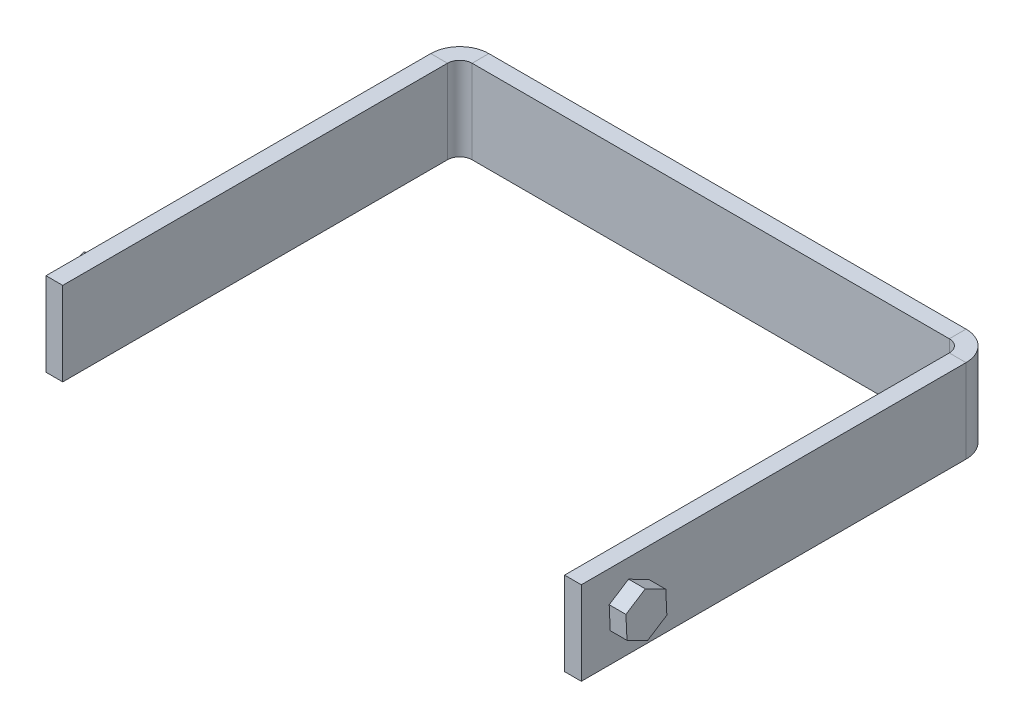
ISO-10303-21;
HEADER;
FILE_DESCRIPTION(('STEP AP214'),'2;1');
FILE_NAME('part.step','',(''),(''),'','','');
FILE_SCHEMA(('AUTOMOTIVE_DESIGN { 1 0 10303 214 1 1 1 1 }'));
ENDSEC;
DATA;
#1=APPLICATION_CONTEXT('core data for automotive mechanical design processes');
#2=APPLICATION_PROTOCOL_DEFINITION('international standard','automotive_design',2000,#1);
#3=PRODUCT_CONTEXT('',#1,'mechanical');
#4=PRODUCT('Part','Part','',(#3));
#5=PRODUCT_RELATED_PRODUCT_CATEGORY('part','',(#4));
#6=PRODUCT_DEFINITION_FORMATION('','',#4);
#7=PRODUCT_DEFINITION_CONTEXT('part definition',#1,'design');
#8=PRODUCT_DEFINITION('design','',#6,#7);
#9=PRODUCT_DEFINITION_SHAPE('','',#8);
#10=(LENGTH_UNIT() NAMED_UNIT(*) SI_UNIT(.MILLI.,.METRE.));
#11=(NAMED_UNIT(*) PLANE_ANGLE_UNIT() SI_UNIT($,.RADIAN.));
#12=(NAMED_UNIT(*) SI_UNIT($,.STERADIAN.) SOLID_ANGLE_UNIT());
#13=UNCERTAINTY_MEASURE_WITH_UNIT(LENGTH_MEASURE(1.E-05),#10,'distance_accuracy_value','');
#14=(GEOMETRIC_REPRESENTATION_CONTEXT(3) GLOBAL_UNCERTAINTY_ASSIGNED_CONTEXT((#13)) GLOBAL_UNIT_ASSIGNED_CONTEXT((#10,
#11,#12)) REPRESENTATION_CONTEXT('',''));
#15=CARTESIAN_POINT('',(0.,0.,0.));
#16=DIRECTION('',(0.,0.,1.));
#17=DIRECTION('',(1.,0.,0.));
#18=AXIS2_PLACEMENT_3D('',#15,#16,#17);
#19=CARTESIAN_POINT('',(-16.,0.,0.));
#20=DIRECTION('',(1.,0.,0.));
#21=DIRECTION('',(0.,0.,-1.));
#22=AXIS2_PLACEMENT_3D('',#19,#20,#21);
#23=PLANE('',#22);
#24=DIRECTION('',(0.,-1.,0.));
#25=VECTOR('',#24,1.);
#26=CARTESIAN_POINT('',(-16.,2.5,0.736599999999993));
#27=LINE('',#26,#25);
#28=CARTESIAN_POINT('',(-16.,-2.5,0.736599999999993));
#29=VERTEX_POINT('',#28);
#30=CARTESIAN_POINT('',(-16.,2.5,0.736599999999993));
#31=VERTEX_POINT('',#30);
#32=EDGE_CURVE('E390',#29,#31,#27,.F.);
#33=ORIENTED_EDGE('',*,*,#32,.F.);
#34=DIRECTION('',(0.,0.,1.));
#35=VECTOR('',#34,1.);
#36=CARTESIAN_POINT('',(-16.,-2.5,0.));
#37=LINE('',#36,#35);
#38=CARTESIAN_POINT('',(-16.0000000000001,-2.5,23.7366));
#39=VERTEX_POINT('',#38);
#40=EDGE_CURVE('E378',#29,#39,#37,.T.);
#41=ORIENTED_EDGE('',*,*,#40,.T.);
#42=DIRECTION('',(0.,1.,0.));
#43=VECTOR('',#42,1.);
#44=CARTESIAN_POINT('',(-16.0000000000001,0.,23.7366));
#45=LINE('',#44,#43);
#46=CARTESIAN_POINT('',(-16.0000000000001,2.5,23.7366));
#47=VERTEX_POINT('',#46);
#48=EDGE_CURVE('E376',#39,#47,#45,.T.);
#49=ORIENTED_EDGE('',*,*,#48,.T.);
#50=DIRECTION('',(0.,0.,-1.));
#51=VECTOR('',#50,1.);
#52=CARTESIAN_POINT('',(-16.,2.5,0.));
#53=LINE('',#52,#51);
#54=EDGE_CURVE('E380',#47,#31,#53,.T.);
#55=ORIENTED_EDGE('',*,*,#54,.T.);
#56=EDGE_LOOP('',(#33,#41,#49,#55));
#57=FACE_BOUND('',#56,.T.);
#58=DIRECTION('',(0.,0.592706894576885,0.80541823739038));
#59=VECTOR('',#58,1.);
#60=CARTESIAN_POINT('',(-16.0000000000001,-1.61001464965031,20.8366627477282));
#61=LINE('',#60,#59);
#62=CARTESIAN_POINT('',(-16.0000000000001,-1.61001464965031,20.8366627477282));
#63=VERTEX_POINT('',#62);
#64=CARTESIAN_POINT('',(-16.0000000000001,-0.649858365278524,22.1414010412317));
#65=VERTEX_POINT('',#64);
#66=EDGE_CURVE('E260',#63,#65,#61,.T.);
#67=ORIENTED_EDGE('',*,*,#66,.F.);
#68=DIRECTION('',(0.,-0.401159206962912,0.916008346396957));
#69=VECTOR('',#68,1.);
#70=CARTESIAN_POINT('',(-16.0000000000001,-0.960156284371791,19.3527738671071));
#71=LINE('',#70,#69);
#72=CARTESIAN_POINT('',(-16.0000000000001,-0.960156284371791,19.3527738671071));
#73=VERTEX_POINT('',#72);
#74=EDGE_CURVE('E257',#73,#63,#71,.T.);
#75=ORIENTED_EDGE('',*,*,#74,.F.);
#76=DIRECTION('',(0.,-0.993866101539797,0.110590109006577));
#77=VECTOR('',#76,1.);
#78=CARTESIAN_POINT('',(-16.0000000000001,0.649858365278522,19.1736232799897));
#79=LINE('',#78,#77);
#80=CARTESIAN_POINT('',(-16.0000000000001,0.649858365278522,19.1736232799897));
#81=VERTEX_POINT('',#80);
#82=EDGE_CURVE('E740',#81,#73,#79,.T.);
#83=ORIENTED_EDGE('',*,*,#82,.F.);
#84=DIRECTION('',(0.,-0.592706894576886,-0.805418237390378));
#85=VECTOR('',#84,1.);
#86=CARTESIAN_POINT('',(-16.0000000000001,1.61001464965032,20.4783615734932));
#87=LINE('',#86,#85);
#88=CARTESIAN_POINT('',(-16.0000000000001,1.61001464965032,20.4783615734932));
#89=VERTEX_POINT('',#88);
#90=EDGE_CURVE('E755',#89,#81,#87,.T.);
#91=ORIENTED_EDGE('',*,*,#90,.F.);
#92=DIRECTION('',(0.,0.401159206962912,-0.916008346396957));
#93=VECTOR('',#92,1.);
#94=CARTESIAN_POINT('',(-16.0000000000001,0.960156284371795,21.9622504541142));
#95=LINE('',#94,#93);
#96=CARTESIAN_POINT('',(-16.0000000000001,0.960156284371794,21.9622504541142));
#97=VERTEX_POINT('',#96);
#98=EDGE_CURVE('E99',#97,#89,#95,.T.);
#99=ORIENTED_EDGE('',*,*,#98,.F.);
#100=DIRECTION('',(0.,0.993866101539797,-0.110590109006577));
#101=VECTOR('',#100,1.);
#102=CARTESIAN_POINT('',(-16.0000000000001,-0.649858365278524,22.1414010412317));
#103=LINE('',#102,#101);
#104=EDGE_CURVE('E94',#65,#97,#103,.T.);
#105=ORIENTED_EDGE('',*,*,#104,.F.);
#106=EDGE_LOOP('',(#67,#75,#83,#91,#99,#105));
#107=FACE_BOUND('',#106,.T.);
#108=ADVANCED_FACE('F77',(#57,#107),#23,.F.);
#109=CARTESIAN_POINT('',(16.,0.,0.));
#110=DIRECTION('',(-1.,0.,0.));
#111=DIRECTION('',(0.,0.,1.));
#112=AXIS2_PLACEMENT_3D('',#109,#110,#111);
#113=PLANE('',#112);
#114=DIRECTION('',(0.,1.,0.));
#115=VECTOR('',#114,1.);
#116=CARTESIAN_POINT('',(16.,-2.5,0.736599999999993));
#117=LINE('',#116,#115);
#118=CARTESIAN_POINT('',(16.,2.5,0.736599999999993));
#119=VERTEX_POINT('',#118);
#120=CARTESIAN_POINT('',(16.,-2.5,0.736599999999993));
#121=VERTEX_POINT('',#120);
#122=EDGE_CURVE('E337',#119,#121,#117,.F.);
#123=ORIENTED_EDGE('',*,*,#122,.F.);
#124=DIRECTION('',(0.,0.,1.));
#125=VECTOR('',#124,1.);
#126=CARTESIAN_POINT('',(16.,2.5,0.));
#127=LINE('',#126,#125);
#128=CARTESIAN_POINT('',(16.0000000000001,2.5,23.7366));
#129=VERTEX_POINT('',#128);
#130=EDGE_CURVE('E325',#119,#129,#127,.T.);
#131=ORIENTED_EDGE('',*,*,#130,.T.);
#132=DIRECTION('',(0.,-1.,0.));
#133=VECTOR('',#132,1.);
#134=CARTESIAN_POINT('',(16.0000000000001,0.,23.7366));
#135=LINE('',#134,#133);
#136=CARTESIAN_POINT('',(16.0000000000001,-2.5,23.7366));
#137=VERTEX_POINT('',#136);
#138=EDGE_CURVE('E323',#129,#137,#135,.T.);
#139=ORIENTED_EDGE('',*,*,#138,.T.);
#140=DIRECTION('',(0.,0.,-1.));
#141=VECTOR('',#140,1.);
#142=CARTESIAN_POINT('',(16.,-2.5,0.));
#143=LINE('',#142,#141);
#144=EDGE_CURVE('E327',#137,#121,#143,.T.);
#145=ORIENTED_EDGE('',*,*,#144,.T.);
#146=EDGE_LOOP('',(#123,#131,#139,#145));
#147=FACE_BOUND('',#146,.T.);
#148=DIRECTION('',(0.,0.53936110364448,-0.842074580946016));
#149=VECTOR('',#148,1.);
#150=CARTESIAN_POINT('',(16.0000000000001,-1.37568604254519,20.7825966217071));
#151=LINE('',#150,#149);
#152=CARTESIAN_POINT('',(16.0000000000001,-1.37568604254519,20.7825966217071));
#153=VERTEX_POINT('',#152);
#154=CARTESIAN_POINT('',(16.0000000000001,-0.632906062300252,19.6229354292825));
#155=VERTEX_POINT('',#154);
#156=EDGE_CURVE('E261',#153,#155,#151,.T.);
#157=ORIENTED_EDGE('',*,*,#156,.F.);
#158=DIRECTION('',(0.,-0.459577427158145,-0.888137708042339));
#159=VECTOR('',#158,1.);
#160=CARTESIAN_POINT('',(16.0000000000001,-0.742779980244938,22.0056935502341));
#161=LINE('',#160,#159);
#162=CARTESIAN_POINT('',(16.0000000000001,-0.742779980244938,22.0056935502341));
#163=VERTEX_POINT('',#162);
#164=EDGE_CURVE('E274',#163,#153,#161,.T.);
#165=ORIENTED_EDGE('',*,*,#164,.F.);
#166=DIRECTION('',(0.,-0.998938530802626,-0.0460631270963242));
#167=VECTOR('',#166,1.);
#168=CARTESIAN_POINT('',(16.0000000000001,0.632906062300256,22.0691292863364));
#169=LINE('',#168,#167);
#170=CARTESIAN_POINT('',(16.0000000000001,0.632906062300256,22.0691292863364));
#171=VERTEX_POINT('',#170);
#172=EDGE_CURVE('E293',#171,#163,#169,.T.);
#173=ORIENTED_EDGE('',*,*,#172,.F.);
#174=DIRECTION('',(0.,-0.53936110364448,0.842074580946016));
#175=VECTOR('',#174,1.);
#176=CARTESIAN_POINT('',(16.0000000000001,1.37568604254519,20.9094680939117));
#177=LINE('',#176,#175);
#178=CARTESIAN_POINT('',(16.0000000000001,1.37568604254519,20.9094680939117));
#179=VERTEX_POINT('',#178);
#180=EDGE_CURVE('E290',#179,#171,#177,.T.);
#181=ORIENTED_EDGE('',*,*,#180,.F.);
#182=DIRECTION('',(0.,0.459577427158145,0.88813770804234));
#183=VECTOR('',#182,1.);
#184=CARTESIAN_POINT('',(16.0000000000001,0.742779980244938,19.6863711653847));
#185=LINE('',#184,#183);
#186=CARTESIAN_POINT('',(16.0000000000001,0.742779980244935,19.6863711653847));
#187=VERTEX_POINT('',#186);
#188=EDGE_CURVE('E287',#187,#179,#185,.T.);
#189=ORIENTED_EDGE('',*,*,#188,.F.);
#190=DIRECTION('',(0.,0.998938530802626,0.0460631270963243));
#191=VECTOR('',#190,1.);
#192=CARTESIAN_POINT('',(16.0000000000001,-0.632906062300252,19.6229354292824));
#193=LINE('',#192,#191);
#194=EDGE_CURVE('E264',#155,#187,#193,.T.);
#195=ORIENTED_EDGE('',*,*,#194,.F.);
#196=EDGE_LOOP('',(#157,#165,#173,#181,#189,#195));
#197=FACE_BOUND('',#196,.T.);
#198=ADVANCED_FACE('F445',(#147,#197),#113,.F.);
#199=CARTESIAN_POINT('',(0.,0.,-1.));
#200=DIRECTION('',(0.,0.,1.));
#201=DIRECTION('',(1.,0.,0.));
#202=AXIS2_PLACEMENT_3D('',#199,#200,#201);
#203=PLANE('',#202);
#204=DIRECTION('',(0.,1.,0.));
#205=VECTOR('',#204,1.);
#206=CARTESIAN_POINT('',(14.2634,2.5,-1.));
#207=LINE('',#206,#205);
#208=CARTESIAN_POINT('',(14.2634,2.5,-1.));
#209=VERTEX_POINT('',#208);
#210=CARTESIAN_POINT('',(14.2634,-2.49999999999999,-1.));
#211=VERTEX_POINT('',#210);
#212=EDGE_CURVE('E346',#209,#211,#207,.F.);
#213=ORIENTED_EDGE('',*,*,#212,.T.);
#214=DIRECTION('',(1.,0.,0.));
#215=VECTOR('',#214,1.);
#216=CARTESIAN_POINT('',(-16.,-2.5,-1.));
#217=LINE('',#216,#215);
#218=CARTESIAN_POINT('',(-14.2634,-2.5,-1.));
#219=VERTEX_POINT('',#218);
#220=EDGE_CURVE('E13',#219,#211,#217,.T.);
#221=ORIENTED_EDGE('',*,*,#220,.F.);
#222=DIRECTION('',(0.,-1.,0.));
#223=VECTOR('',#222,1.);
#224=CARTESIAN_POINT('',(-14.2634,-2.5,-1.));
#225=LINE('',#224,#223);
#226=CARTESIAN_POINT('',(-14.2634,2.50000000000001,-1.));
#227=VERTEX_POINT('',#226);
#228=EDGE_CURVE('E399',#219,#227,#225,.F.);
#229=ORIENTED_EDGE('',*,*,#228,.T.);
#230=DIRECTION('',(-1.,0.,0.));
#231=VECTOR('',#230,1.);
#232=CARTESIAN_POINT('',(-16.,2.5,-1.));
#233=LINE('',#232,#231);
#234=EDGE_CURVE('E86',#209,#227,#233,.T.);
#235=ORIENTED_EDGE('',*,*,#234,.F.);
#236=EDGE_LOOP('',(#213,#221,#229,#235));
#237=FACE_BOUND('',#236,.T.);
#238=ADVANCED_FACE('F478',(#237),#203,.F.);
#239=CARTESIAN_POINT('',(0.,0.,0.));
#240=DIRECTION('',(0.,0.,1.));
#241=DIRECTION('',(1.,0.,0.));
#242=AXIS2_PLACEMENT_3D('',#239,#240,#241);
#243=PLANE('',#242);
#244=DIRECTION('',(1.,0.,0.));
#245=VECTOR('',#244,1.);
#246=CARTESIAN_POINT('',(-16.,-2.5,0.));
#247=LINE('',#246,#245);
#248=CARTESIAN_POINT('',(-14.2634,-2.5,0.));
#249=VERTEX_POINT('',#248);
#250=CARTESIAN_POINT('',(14.2634,-2.5,0.));
#251=VERTEX_POINT('',#250);
#252=EDGE_CURVE('E81',#249,#251,#247,.T.);
#253=ORIENTED_EDGE('',*,*,#252,.T.);
#254=DIRECTION('',(0.,1.,0.));
#255=VECTOR('',#254,1.);
#256=CARTESIAN_POINT('',(14.2634,2.5,0.));
#257=LINE('',#256,#255);
#258=CARTESIAN_POINT('',(14.2634,2.5,0.));
#259=VERTEX_POINT('',#258);
#260=EDGE_CURVE('E358',#259,#251,#257,.F.);
#261=ORIENTED_EDGE('',*,*,#260,.F.);
#262=DIRECTION('',(-1.,0.,0.));
#263=VECTOR('',#262,1.);
#264=CARTESIAN_POINT('',(-16.,2.5,0.));
#265=LINE('',#264,#263);
#266=CARTESIAN_POINT('',(-14.2634,2.5,0.));
#267=VERTEX_POINT('',#266);
#268=EDGE_CURVE('E420',#259,#267,#265,.T.);
#269=ORIENTED_EDGE('',*,*,#268,.T.);
#270=DIRECTION('',(0.,-1.,0.));
#271=VECTOR('',#270,1.);
#272=CARTESIAN_POINT('',(-14.2634,-2.5,0.));
#273=LINE('',#272,#271);
#274=EDGE_CURVE('E412',#249,#267,#273,.F.);
#275=ORIENTED_EDGE('',*,*,#274,.F.);
#276=EDGE_LOOP('',(#253,#261,#269,#275));
#277=FACE_BOUND('',#276,.T.);
#278=ADVANCED_FACE('F428',(#277),#243,.T.);
#279=CARTESIAN_POINT('',(-16.,2.5,-1.));
#280=DIRECTION('',(0.,1.,0.));
#281=DIRECTION('',(0.,0.,1.));
#282=AXIS2_PLACEMENT_3D('',#279,#280,#281);
#283=PLANE('',#282);
#284=ORIENTED_EDGE('',*,*,#268,.F.);
#285=DIRECTION('',(0.,0.,-1.));
#286=VECTOR('',#285,1.);
#287=CARTESIAN_POINT('',(14.2634,2.5,0.));
#288=LINE('',#287,#286);
#289=EDGE_CURVE('E352',#259,#209,#288,.T.);
#290=ORIENTED_EDGE('',*,*,#289,.T.);
#291=ORIENTED_EDGE('',*,*,#234,.T.);
#292=DIRECTION('',(0.,0.,-1.));
#293=VECTOR('',#292,1.);
#294=CARTESIAN_POINT('',(-14.2634,2.5,0.));
#295=LINE('',#294,#293);
#296=EDGE_CURVE('E417',#267,#227,#295,.T.);
#297=ORIENTED_EDGE('',*,*,#296,.F.);
#298=EDGE_LOOP('',(#284,#290,#291,#297));
#299=FACE_BOUND('',#298,.T.);
#300=ADVANCED_FACE('F79',(#299),#283,.T.);
#301=CARTESIAN_POINT('',(-16.,-2.5,-1.));
#302=DIRECTION('',(0.,-1.,0.));
#303=DIRECTION('',(0.,0.,-1.));
#304=AXIS2_PLACEMENT_3D('',#301,#302,#303);
#305=PLANE('',#304);
#306=DIRECTION('',(0.,0.,-1.));
#307=VECTOR('',#306,1.);
#308=CARTESIAN_POINT('',(14.2634,-2.5,0.));
#309=LINE('',#308,#307);
#310=EDGE_CURVE('E363',#251,#211,#309,.T.);
#311=ORIENTED_EDGE('',*,*,#310,.F.);
#312=ORIENTED_EDGE('',*,*,#252,.F.);
#313=DIRECTION('',(0.,0.,-1.));
#314=VECTOR('',#313,1.);
#315=CARTESIAN_POINT('',(-14.2634,-2.5,0.));
#316=LINE('',#315,#314);
#317=EDGE_CURVE('E406',#249,#219,#316,.T.);
#318=ORIENTED_EDGE('',*,*,#317,.T.);
#319=ORIENTED_EDGE('',*,*,#220,.T.);
#320=EDGE_LOOP('',(#311,#312,#318,#319));
#321=FACE_BOUND('',#320,.T.);
#322=ADVANCED_FACE('F512',(#321),#305,.T.);
#323=CARTESIAN_POINT('',(-14.2634,2.5,0.7366));
#324=DIRECTION('',(0.,1.,0.));
#325=DIRECTION('',(0.,0.,1.));
#326=AXIS2_PLACEMENT_3D('',#323,#324,#325);
#327=PLANE('',#326);
#328=DIRECTION('',(1.,0.,0.));
#329=VECTOR('',#328,1.);
#330=CARTESIAN_POINT('',(-16.,2.5,0.736599999999993));
#331=LINE('',#330,#329);
#332=CARTESIAN_POINT('',(-15.,2.5,0.736599999999997));
#333=VERTEX_POINT('',#332);
#334=EDGE_CURVE('E366',#333,#31,#331,.F.);
#335=ORIENTED_EDGE('',*,*,#334,.F.);
#336=CARTESIAN_POINT('',(-14.2634,2.5,0.7366));
#337=DIRECTION('',(0.,-1.,0.));
#338=DIRECTION('',(0.,0.,-1.));
#339=AXIS2_PLACEMENT_3D('',#336,#337,#338);
#340=CIRCLE('',#339,0.7366);
#341=EDGE_CURVE('E409',#267,#333,#340,.F.);
#342=ORIENTED_EDGE('',*,*,#341,.F.);
#343=ORIENTED_EDGE('',*,*,#296,.T.);
#344=CARTESIAN_POINT('',(-14.2634,2.5,0.7366));
#345=DIRECTION('',(0.,-1.,0.));
#346=DIRECTION('',(0.,0.,-1.));
#347=AXIS2_PLACEMENT_3D('',#344,#345,#346);
#348=CIRCLE('',#347,1.7366);
#349=EDGE_CURVE('E402',#227,#31,#348,.F.);
#350=ORIENTED_EDGE('',*,*,#349,.T.);
#351=EDGE_LOOP('',(#335,#342,#343,#350));
#352=FACE_BOUND('',#351,.T.);
#353=ADVANCED_FACE('F509',(#352),#327,.T.);
#354=CARTESIAN_POINT('',(-14.2634,-2.5,0.7366));
#355=DIRECTION('',(0.,1.,0.));
#356=DIRECTION('',(0.,0.,1.));
#357=AXIS2_PLACEMENT_3D('',#354,#355,#356);
#358=PLANE('',#357);
#359=CARTESIAN_POINT('',(-14.2634,-2.5,0.7366));
#360=DIRECTION('',(0.,-1.,0.));
#361=DIRECTION('',(0.,0.,-1.));
#362=AXIS2_PLACEMENT_3D('',#359,#360,#361);
#363=CIRCLE('',#362,0.7366);
#364=CARTESIAN_POINT('',(-15.,-2.5,0.736599999999997));
#365=VERTEX_POINT('',#364);
#366=EDGE_CURVE('E372',#365,#249,#363,.T.);
#367=ORIENTED_EDGE('',*,*,#366,.F.);
#368=DIRECTION('',(1.,0.,0.));
#369=VECTOR('',#368,1.);
#370=CARTESIAN_POINT('',(-15.,-2.5,0.736599999999997));
#371=LINE('',#370,#369);
#372=EDGE_CURVE('E392',#365,#29,#371,.F.);
#373=ORIENTED_EDGE('',*,*,#372,.T.);
#374=CARTESIAN_POINT('',(-14.2634,-2.5,0.7366));
#375=DIRECTION('',(0.,-1.,0.));
#376=DIRECTION('',(0.,0.,-1.));
#377=AXIS2_PLACEMENT_3D('',#374,#375,#376);
#378=CIRCLE('',#377,1.7366);
#379=EDGE_CURVE('E403',#29,#219,#378,.T.);
#380=ORIENTED_EDGE('',*,*,#379,.T.);
#381=ORIENTED_EDGE('',*,*,#317,.F.);
#382=EDGE_LOOP('',(#367,#373,#380,#381));
#383=FACE_BOUND('',#382,.T.);
#384=ADVANCED_FACE('F504',(#383),#358,.F.);
#385=CARTESIAN_POINT('',(-14.2634,-2.5,0.7366));
#386=DIRECTION('',(0.,-1.,0.));
#387=DIRECTION('',(-1.,0.,0.));
#388=AXIS2_PLACEMENT_3D('',#385,#386,#387);
#389=CYLINDRICAL_SURFACE('',#388,1.7366);
#390=ORIENTED_EDGE('',*,*,#228,.F.);
#391=ORIENTED_EDGE('',*,*,#379,.F.);
#392=ORIENTED_EDGE('',*,*,#32,.T.);
#393=ORIENTED_EDGE('',*,*,#349,.F.);
#394=EDGE_LOOP('',(#390,#391,#392,#393));
#395=FACE_BOUND('',#394,.T.);
#396=ADVANCED_FACE('F501',(#395),#389,.T.);
#397=CARTESIAN_POINT('',(-14.2634,-2.5,0.7366));
#398=DIRECTION('',(0.,-1.,0.));
#399=DIRECTION('',(-1.,0.,0.));
#400=AXIS2_PLACEMENT_3D('',#397,#398,#399);
#401=CYLINDRICAL_SURFACE('',#400,0.7366);
#402=ORIENTED_EDGE('',*,*,#274,.T.);
#403=ORIENTED_EDGE('',*,*,#341,.T.);
#404=DIRECTION('',(0.,-1.,0.));
#405=VECTOR('',#404,1.);
#406=CARTESIAN_POINT('',(-15.,2.5,0.736599999999997));
#407=LINE('',#406,#405);
#408=EDGE_CURVE('E395',#333,#365,#407,.T.);
#409=ORIENTED_EDGE('',*,*,#408,.T.);
#410=ORIENTED_EDGE('',*,*,#366,.T.);
#411=EDGE_LOOP('',(#402,#403,#409,#410));
#412=FACE_BOUND('',#411,.T.);
#413=ADVANCED_FACE('F499',(#412),#401,.F.);
#414=CARTESIAN_POINT('',(-16.,2.5,0.));
#415=DIRECTION('',(0.,-1.,0.));
#416=DIRECTION('',(0.,0.,-1.));
#417=AXIS2_PLACEMENT_3D('',#414,#415,#416);
#418=PLANE('',#417);
#419=ORIENTED_EDGE('',*,*,#334,.T.);
#420=ORIENTED_EDGE('',*,*,#54,.F.);
#421=DIRECTION('',(1.,0.,0.));
#422=VECTOR('',#421,1.);
#423=CARTESIAN_POINT('',(-16.0000000000001,2.5,23.7366));
#424=LINE('',#423,#422);
#425=CARTESIAN_POINT('',(-15.0000000000001,2.5,23.7366));
#426=VERTEX_POINT('',#425);
#427=EDGE_CURVE('E373',#47,#426,#424,.T.);
#428=ORIENTED_EDGE('',*,*,#427,.T.);
#429=DIRECTION('',(0.,0.,1.));
#430=VECTOR('',#429,1.);
#431=CARTESIAN_POINT('',(-15.,2.5,0.));
#432=LINE('',#431,#430);
#433=EDGE_CURVE('E387',#426,#333,#432,.F.);
#434=ORIENTED_EDGE('',*,*,#433,.T.);
#435=EDGE_LOOP('',(#419,#420,#428,#434));
#436=FACE_BOUND('',#435,.T.);
#437=ADVANCED_FACE('F495',(#436),#418,.F.);
#438=CARTESIAN_POINT('',(-16.0000000000001,-2.5,23.7366));
#439=DIRECTION('',(0.,1.,0.));
#440=DIRECTION('',(0.,0.,1.));
#441=AXIS2_PLACEMENT_3D('',#438,#439,#440);
#442=PLANE('',#441);
#443=ORIENTED_EDGE('',*,*,#372,.F.);
#444=DIRECTION('',(0.,0.,-1.));
#445=VECTOR('',#444,1.);
#446=CARTESIAN_POINT('',(-15.0000000000001,-2.5,23.7366));
#447=LINE('',#446,#445);
#448=CARTESIAN_POINT('',(-15.0000000000001,-2.5,23.7366));
#449=VERTEX_POINT('',#448);
#450=EDGE_CURVE('E385',#365,#449,#447,.F.);
#451=ORIENTED_EDGE('',*,*,#450,.T.);
#452=DIRECTION('',(1.,0.,0.));
#453=VECTOR('',#452,1.);
#454=CARTESIAN_POINT('',(-16.0000000000001,-2.5,23.7366));
#455=LINE('',#454,#453);
#456=EDGE_CURVE('E369',#39,#449,#455,.T.);
#457=ORIENTED_EDGE('',*,*,#456,.F.);
#458=ORIENTED_EDGE('',*,*,#40,.F.);
#459=EDGE_LOOP('',(#443,#451,#457,#458));
#460=FACE_BOUND('',#459,.T.);
#461=ADVANCED_FACE('F488',(#460),#442,.F.);
#462=CARTESIAN_POINT('',(-15.,0.,0.));
#463=DIRECTION('',(1.,0.,0.));
#464=DIRECTION('',(0.,0.,-1.));
#465=AXIS2_PLACEMENT_3D('',#462,#463,#464);
#466=PLANE('',#465);
#467=ORIENTED_EDGE('',*,*,#450,.F.);
#468=ORIENTED_EDGE('',*,*,#408,.F.);
#469=ORIENTED_EDGE('',*,*,#433,.F.);
#470=DIRECTION('',(0.,-1.,0.));
#471=VECTOR('',#470,1.);
#472=CARTESIAN_POINT('',(-15.0000000000001,2.5,23.7366));
#473=LINE('',#472,#471);
#474=EDGE_CURVE('E383',#449,#426,#473,.F.);
#475=ORIENTED_EDGE('',*,*,#474,.F.);
#476=EDGE_LOOP('',(#467,#468,#469,#475));
#477=FACE_BOUND('',#476,.T.);
#478=ADVANCED_FACE('F484',(#477),#466,.T.);
#479=CARTESIAN_POINT('',(-16.0000000000001,2.5,23.7366));
#480=DIRECTION('',(0.,0.,-1.));
#481=DIRECTION('',(-1.,0.,0.));
#482=AXIS2_PLACEMENT_3D('',#479,#480,#481);
#483=PLANE('',#482);
#484=ORIENTED_EDGE('',*,*,#474,.T.);
#485=ORIENTED_EDGE('',*,*,#427,.F.);
#486=ORIENTED_EDGE('',*,*,#48,.F.);
#487=ORIENTED_EDGE('',*,*,#456,.T.);
#488=EDGE_LOOP('',(#484,#485,#486,#487));
#489=FACE_BOUND('',#488,.T.);
#490=ADVANCED_FACE('F487',(#489),#483,.F.);
#491=CARTESIAN_POINT('',(14.2634,-2.5,0.7366));
#492=DIRECTION('',(0.,-1.,0.));
#493=DIRECTION('',(0.,0.,-1.));
#494=AXIS2_PLACEMENT_3D('',#491,#492,#493);
#495=PLANE('',#494);
#496=DIRECTION('',(-1.,0.,0.));
#497=VECTOR('',#496,1.);
#498=CARTESIAN_POINT('',(16.,-2.5,0.736599999999993));
#499=LINE('',#498,#497);
#500=CARTESIAN_POINT('',(15.,-2.5,0.736599999999997));
#501=VERTEX_POINT('',#500);
#502=EDGE_CURVE('E315',#501,#121,#499,.F.);
#503=ORIENTED_EDGE('',*,*,#502,.F.);
#504=CARTESIAN_POINT('',(14.2634,-2.5,0.7366));
#505=DIRECTION('',(0.,1.,0.));
#506=DIRECTION('',(0.,0.,1.));
#507=AXIS2_PLACEMENT_3D('',#504,#505,#506);
#508=CIRCLE('',#507,0.7366);
#509=EDGE_CURVE('E355',#251,#501,#508,.F.);
#510=ORIENTED_EDGE('',*,*,#509,.F.);
#511=ORIENTED_EDGE('',*,*,#310,.T.);
#512=CARTESIAN_POINT('',(14.2634,-2.5,0.7366));
#513=DIRECTION('',(0.,1.,0.));
#514=DIRECTION('',(0.,0.,1.));
#515=AXIS2_PLACEMENT_3D('',#512,#513,#514);
#516=CIRCLE('',#515,1.7366);
#517=EDGE_CURVE('E348',#211,#121,#516,.F.);
#518=ORIENTED_EDGE('',*,*,#517,.T.);
#519=EDGE_LOOP('',(#503,#510,#511,#518));
#520=FACE_BOUND('',#519,.T.);
#521=ADVANCED_FACE('F437',(#520),#495,.T.);
#522=CARTESIAN_POINT('',(14.2634,2.5,0.7366));
#523=DIRECTION('',(0.,-1.,0.));
#524=DIRECTION('',(0.,0.,-1.));
#525=AXIS2_PLACEMENT_3D('',#522,#523,#524);
#526=PLANE('',#525);
#527=CARTESIAN_POINT('',(14.2634,2.5,0.7366));
#528=DIRECTION('',(0.,1.,0.));
#529=DIRECTION('',(0.,0.,1.));
#530=AXIS2_PLACEMENT_3D('',#527,#528,#529);
#531=CIRCLE('',#530,0.7366);
#532=CARTESIAN_POINT('',(15.,2.5,0.736599999999997));
#533=VERTEX_POINT('',#532);
#534=EDGE_CURVE('E319',#533,#259,#531,.T.);
#535=ORIENTED_EDGE('',*,*,#534,.F.);
#536=DIRECTION('',(-1.,0.,0.));
#537=VECTOR('',#536,1.);
#538=CARTESIAN_POINT('',(15.,2.5,0.736599999999997));
#539=LINE('',#538,#537);
#540=EDGE_CURVE('E339',#533,#119,#539,.F.);
#541=ORIENTED_EDGE('',*,*,#540,.T.);
#542=CARTESIAN_POINT('',(14.2634,2.5,0.7366));
#543=DIRECTION('',(0.,1.,0.));
#544=DIRECTION('',(0.,0.,1.));
#545=AXIS2_PLACEMENT_3D('',#542,#543,#544);
#546=CIRCLE('',#545,1.7366);
#547=EDGE_CURVE('E349',#119,#209,#546,.T.);
#548=ORIENTED_EDGE('',*,*,#547,.T.);
#549=ORIENTED_EDGE('',*,*,#289,.F.);
#550=EDGE_LOOP('',(#535,#541,#548,#549));
#551=FACE_BOUND('',#550,.T.);
#552=ADVANCED_FACE('F460',(#551),#526,.F.);
#553=CARTESIAN_POINT('',(14.2634,2.5,0.7366));
#554=DIRECTION('',(0.,1.,0.));
#555=DIRECTION('',(1.,0.,0.));
#556=AXIS2_PLACEMENT_3D('',#553,#554,#555);
#557=CYLINDRICAL_SURFACE('',#556,1.7366);
#558=ORIENTED_EDGE('',*,*,#212,.F.);
#559=ORIENTED_EDGE('',*,*,#547,.F.);
#560=ORIENTED_EDGE('',*,*,#122,.T.);
#561=ORIENTED_EDGE('',*,*,#517,.F.);
#562=EDGE_LOOP('',(#558,#559,#560,#561));
#563=FACE_BOUND('',#562,.T.);
#564=ADVANCED_FACE('F529',(#563),#557,.T.);
#565=CARTESIAN_POINT('',(14.2634,2.5,0.7366));
#566=DIRECTION('',(0.,1.,0.));
#567=DIRECTION('',(1.,0.,0.));
#568=AXIS2_PLACEMENT_3D('',#565,#566,#567);
#569=CYLINDRICAL_SURFACE('',#568,0.7366);
#570=ORIENTED_EDGE('',*,*,#260,.T.);
#571=ORIENTED_EDGE('',*,*,#509,.T.);
#572=DIRECTION('',(0.,1.,0.));
#573=VECTOR('',#572,1.);
#574=CARTESIAN_POINT('',(15.,-2.5,0.736599999999997));
#575=LINE('',#574,#573);
#576=EDGE_CURVE('E342',#501,#533,#575,.T.);
#577=ORIENTED_EDGE('',*,*,#576,.T.);
#578=ORIENTED_EDGE('',*,*,#534,.T.);
#579=EDGE_LOOP('',(#570,#571,#577,#578));
#580=FACE_BOUND('',#579,.T.);
#581=ADVANCED_FACE('F433',(#580),#569,.F.);
#582=CARTESIAN_POINT('',(16.,-2.5,0.));
#583=DIRECTION('',(0.,1.,0.));
#584=DIRECTION('',(0.,0.,1.));
#585=AXIS2_PLACEMENT_3D('',#582,#583,#584);
#586=PLANE('',#585);
#587=ORIENTED_EDGE('',*,*,#502,.T.);
#588=ORIENTED_EDGE('',*,*,#144,.F.);
#589=DIRECTION('',(-1.,0.,0.));
#590=VECTOR('',#589,1.);
#591=CARTESIAN_POINT('',(16.0000000000001,-2.5,23.7366));
#592=LINE('',#591,#590);
#593=CARTESIAN_POINT('',(15.0000000000001,-2.5,23.7366));
#594=VERTEX_POINT('',#593);
#595=EDGE_CURVE('E320',#137,#594,#592,.T.);
#596=ORIENTED_EDGE('',*,*,#595,.T.);
#597=DIRECTION('',(0.,0.,1.));
#598=VECTOR('',#597,1.);
#599=CARTESIAN_POINT('',(15.,-2.5,0.));
#600=LINE('',#599,#598);
#601=EDGE_CURVE('E334',#594,#501,#600,.F.);
#602=ORIENTED_EDGE('',*,*,#601,.T.);
#603=EDGE_LOOP('',(#587,#588,#596,#602));
#604=FACE_BOUND('',#603,.T.);
#605=ADVANCED_FACE('F441',(#604),#586,.F.);
#606=CARTESIAN_POINT('',(16.0000000000001,2.5,23.7366));
#607=DIRECTION('',(0.,-1.,0.));
#608=DIRECTION('',(0.,0.,-1.));
#609=AXIS2_PLACEMENT_3D('',#606,#607,#608);
#610=PLANE('',#609);
#611=ORIENTED_EDGE('',*,*,#540,.F.);
#612=DIRECTION('',(0.,0.,-1.));
#613=VECTOR('',#612,1.);
#614=CARTESIAN_POINT('',(15.0000000000001,2.5,23.7366));
#615=LINE('',#614,#613);
#616=CARTESIAN_POINT('',(15.0000000000001,2.5,23.7366));
#617=VERTEX_POINT('',#616);
#618=EDGE_CURVE('E332',#533,#617,#615,.F.);
#619=ORIENTED_EDGE('',*,*,#618,.T.);
#620=DIRECTION('',(-1.,0.,0.));
#621=VECTOR('',#620,1.);
#622=CARTESIAN_POINT('',(16.0000000000001,2.5,23.7366));
#623=LINE('',#622,#621);
#624=EDGE_CURVE('E316',#129,#617,#623,.T.);
#625=ORIENTED_EDGE('',*,*,#624,.F.);
#626=ORIENTED_EDGE('',*,*,#130,.F.);
#627=EDGE_LOOP('',(#611,#619,#625,#626));
#628=FACE_BOUND('',#627,.T.);
#629=ADVANCED_FACE('F462',(#628),#610,.F.);
#630=CARTESIAN_POINT('',(15.,0.,0.));
#631=DIRECTION('',(-1.,0.,0.));
#632=DIRECTION('',(0.,0.,1.));
#633=AXIS2_PLACEMENT_3D('',#630,#631,#632);
#634=PLANE('',#633);
#635=ORIENTED_EDGE('',*,*,#618,.F.);
#636=ORIENTED_EDGE('',*,*,#576,.F.);
#637=ORIENTED_EDGE('',*,*,#601,.F.);
#638=DIRECTION('',(0.,1.,0.));
#639=VECTOR('',#638,1.);
#640=CARTESIAN_POINT('',(15.0000000000001,-2.5,23.7366));
#641=LINE('',#640,#639);
#642=EDGE_CURVE('E330',#617,#594,#641,.F.);
#643=ORIENTED_EDGE('',*,*,#642,.F.);
#644=EDGE_LOOP('',(#635,#636,#637,#643));
#645=FACE_BOUND('',#644,.T.);
#646=ADVANCED_FACE('F456',(#645),#634,.T.);
#647=CARTESIAN_POINT('',(16.0000000000001,-2.5,23.7366));
#648=DIRECTION('',(0.,0.,-1.));
#649=DIRECTION('',(-1.,0.,0.));
#650=AXIS2_PLACEMENT_3D('',#647,#648,#649);
#651=PLANE('',#650);
#652=ORIENTED_EDGE('',*,*,#642,.T.);
#653=ORIENTED_EDGE('',*,*,#595,.F.);
#654=ORIENTED_EDGE('',*,*,#138,.F.);
#655=ORIENTED_EDGE('',*,*,#624,.T.);
#656=EDGE_LOOP('',(#652,#653,#654,#655));
#657=FACE_BOUND('',#656,.T.);
#658=ADVANCED_FACE('F452',(#657),#651,.F.);
#659=CARTESIAN_POINT('',(17.0000000000001,-1.37568604254519,20.7825966217071));
#660=DIRECTION('',(0.,0.842074580946016,0.53936110364448));
#661=DIRECTION('',(0.,-0.53936110364448,0.842074580946016));
#662=AXIS2_PLACEMENT_3D('',#659,#660,#661);
#663=PLANE('',#662);
#664=ORIENTED_EDGE('',*,*,#156,.T.);
#665=DIRECTION('',(-1.,0.,0.));
#666=VECTOR('',#665,1.);
#667=CARTESIAN_POINT('',(17.0000000000001,-0.632906062300252,19.6229354292824));
#668=LINE('',#667,#666);
#669=CARTESIAN_POINT('',(17.0000000000001,-0.632906062300252,19.6229354292824));
#670=VERTEX_POINT('',#669);
#671=EDGE_CURVE('E312',#670,#155,#668,.T.);
#672=ORIENTED_EDGE('',*,*,#671,.F.);
#673=DIRECTION('',(0.,0.53936110364448,-0.842074580946016));
#674=VECTOR('',#673,1.);
#675=CARTESIAN_POINT('',(17.0000000000001,-1.37568604254519,20.7825966217071));
#676=LINE('',#675,#674);
#677=CARTESIAN_POINT('',(17.0000000000001,-1.37568604254519,20.7825966217071));
#678=VERTEX_POINT('',#677);
#679=EDGE_CURVE('E270',#678,#670,#676,.T.);
#680=ORIENTED_EDGE('',*,*,#679,.F.);
#681=DIRECTION('',(-1.,0.,0.));
#682=VECTOR('',#681,1.);
#683=CARTESIAN_POINT('',(17.0000000000001,-1.37568604254519,20.7825966217071));
#684=LINE('',#683,#682);
#685=EDGE_CURVE('E283',#678,#153,#684,.T.);
#686=ORIENTED_EDGE('',*,*,#685,.T.);
#687=EDGE_LOOP('',(#664,#672,#680,#686));
#688=FACE_BOUND('',#687,.T.);
#689=ADVANCED_FACE('F587',(#688),#663,.F.);
#690=CARTESIAN_POINT('',(17.0000000000001,-0.632906062300252,19.6229354292824));
#691=DIRECTION('',(0.,-0.0460631270963243,0.998938530802626));
#692=DIRECTION('',(0.,-0.998938530802626,-0.0460631270963243));
#693=AXIS2_PLACEMENT_3D('',#690,#691,#692);
#694=PLANE('',#693);
#695=ORIENTED_EDGE('',*,*,#194,.T.);
#696=DIRECTION('',(-1.,0.,0.));
#697=VECTOR('',#696,1.);
#698=CARTESIAN_POINT('',(17.0000000000001,0.742779980244938,19.6863711653847));
#699=LINE('',#698,#697);
#700=CARTESIAN_POINT('',(17.0000000000001,0.742779980244938,19.6863711653847));
#701=VERTEX_POINT('',#700);
#702=EDGE_CURVE('E309',#701,#187,#699,.T.);
#703=ORIENTED_EDGE('',*,*,#702,.F.);
#704=DIRECTION('',(0.,0.998938530802626,0.0460631270963243));
#705=VECTOR('',#704,1.);
#706=CARTESIAN_POINT('',(17.0000000000001,-0.632906062300252,19.6229354292824));
#707=LINE('',#706,#705);
#708=EDGE_CURVE('E273',#670,#701,#707,.T.);
#709=ORIENTED_EDGE('',*,*,#708,.F.);
#710=ORIENTED_EDGE('',*,*,#671,.T.);
#711=EDGE_LOOP('',(#695,#703,#709,#710));
#712=FACE_BOUND('',#711,.T.);
#713=ADVANCED_FACE('F603',(#712),#694,.F.);
#714=CARTESIAN_POINT('',(17.0000000000001,0.742779980244938,19.6863711653847));
#715=DIRECTION('',(0.,-0.88813770804234,0.459577427158145));
#716=DIRECTION('',(0.,-0.459577427158145,-0.88813770804234));
#717=AXIS2_PLACEMENT_3D('',#714,#715,#716);
#718=PLANE('',#717);
#719=ORIENTED_EDGE('',*,*,#188,.T.);
#720=DIRECTION('',(-1.,0.,0.));
#721=VECTOR('',#720,1.);
#722=CARTESIAN_POINT('',(17.0000000000001,1.37568604254519,20.9094680939117));
#723=LINE('',#722,#721);
#724=CARTESIAN_POINT('',(17.0000000000001,1.37568604254519,20.9094680939117));
#725=VERTEX_POINT('',#724);
#726=EDGE_CURVE('E306',#725,#179,#723,.T.);
#727=ORIENTED_EDGE('',*,*,#726,.F.);
#728=DIRECTION('',(0.,0.459577427158145,0.88813770804234));
#729=VECTOR('',#728,1.);
#730=CARTESIAN_POINT('',(17.0000000000001,0.742779980244938,19.6863711653847));
#731=LINE('',#730,#729);
#732=EDGE_CURVE('E276',#701,#725,#731,.T.);
#733=ORIENTED_EDGE('',*,*,#732,.F.);
#734=ORIENTED_EDGE('',*,*,#702,.T.);
#735=EDGE_LOOP('',(#719,#727,#733,#734));
#736=FACE_BOUND('',#735,.T.);
#737=ADVANCED_FACE('F613',(#736),#718,.F.);
#738=CARTESIAN_POINT('',(17.0000000000001,1.37568604254519,20.9094680939117));
#739=DIRECTION('',(0.,-0.842074580946016,-0.53936110364448));
#740=DIRECTION('',(0.,0.53936110364448,-0.842074580946016));
#741=AXIS2_PLACEMENT_3D('',#738,#739,#740);
#742=PLANE('',#741);
#743=ORIENTED_EDGE('',*,*,#180,.T.);
#744=DIRECTION('',(-1.,0.,0.));
#745=VECTOR('',#744,1.);
#746=CARTESIAN_POINT('',(17.0000000000001,0.632906062300256,22.0691292863364));
#747=LINE('',#746,#745);
#748=CARTESIAN_POINT('',(17.0000000000001,0.632906062300256,22.0691292863364));
#749=VERTEX_POINT('',#748);
#750=EDGE_CURVE('E303',#749,#171,#747,.T.);
#751=ORIENTED_EDGE('',*,*,#750,.F.);
#752=DIRECTION('',(0.,-0.53936110364448,0.842074580946016));
#753=VECTOR('',#752,1.);
#754=CARTESIAN_POINT('',(17.0000000000001,1.37568604254519,20.9094680939117));
#755=LINE('',#754,#753);
#756=EDGE_CURVE('E278',#725,#749,#755,.T.);
#757=ORIENTED_EDGE('',*,*,#756,.F.);
#758=ORIENTED_EDGE('',*,*,#726,.T.);
#759=EDGE_LOOP('',(#743,#751,#757,#758));
#760=FACE_BOUND('',#759,.T.);
#761=ADVANCED_FACE('F623',(#760),#742,.F.);
#762=CARTESIAN_POINT('',(17.0000000000001,0.632906062300256,22.0691292863364));
#763=DIRECTION('',(0.,0.0460631270963242,-0.998938530802626));
#764=DIRECTION('',(0.,0.998938530802626,0.0460631270963242));
#765=AXIS2_PLACEMENT_3D('',#762,#763,#764);
#766=PLANE('',#765);
#767=ORIENTED_EDGE('',*,*,#172,.T.);
#768=DIRECTION('',(-1.,0.,0.));
#769=VECTOR('',#768,1.);
#770=CARTESIAN_POINT('',(17.0000000000001,-0.742779980244938,22.0056935502341));
#771=LINE('',#770,#769);
#772=CARTESIAN_POINT('',(17.0000000000001,-0.742779980244938,22.0056935502341));
#773=VERTEX_POINT('',#772);
#774=EDGE_CURVE('E300',#773,#163,#771,.T.);
#775=ORIENTED_EDGE('',*,*,#774,.F.);
#776=DIRECTION('',(0.,-0.998938530802626,-0.0460631270963242));
#777=VECTOR('',#776,1.);
#778=CARTESIAN_POINT('',(17.0000000000001,0.632906062300256,22.0691292863364));
#779=LINE('',#778,#777);
#780=EDGE_CURVE('E280',#749,#773,#779,.T.);
#781=ORIENTED_EDGE('',*,*,#780,.F.);
#782=ORIENTED_EDGE('',*,*,#750,.T.);
#783=EDGE_LOOP('',(#767,#775,#781,#782));
#784=FACE_BOUND('',#783,.T.);
#785=ADVANCED_FACE('F633',(#784),#766,.F.);
#786=CARTESIAN_POINT('',(17.0000000000001,-0.742779980244938,22.0056935502341));
#787=DIRECTION('',(0.,0.888137708042339,-0.459577427158145));
#788=DIRECTION('',(0.,0.459577427158145,0.888137708042339));
#789=AXIS2_PLACEMENT_3D('',#786,#787,#788);
#790=PLANE('',#789);
#791=ORIENTED_EDGE('',*,*,#164,.T.);
#792=ORIENTED_EDGE('',*,*,#685,.F.);
#793=DIRECTION('',(0.,-0.459577427158145,-0.888137708042339));
#794=VECTOR('',#793,1.);
#795=CARTESIAN_POINT('',(17.0000000000001,-0.742779980244938,22.0056935502341));
#796=LINE('',#795,#794);
#797=EDGE_CURVE('E282',#773,#678,#796,.T.);
#798=ORIENTED_EDGE('',*,*,#797,.F.);
#799=ORIENTED_EDGE('',*,*,#774,.T.);
#800=EDGE_LOOP('',(#791,#792,#798,#799));
#801=FACE_BOUND('',#800,.T.);
#802=ADVANCED_FACE('F643',(#801),#790,.F.);
#803=CARTESIAN_POINT('',(17.,0.,0.));
#804=DIRECTION('',(1.,0.,0.));
#805=DIRECTION('',(0.,0.,-1.));
#806=AXIS2_PLACEMENT_3D('',#803,#804,#805);
#807=PLANE('',#806);
#808=ORIENTED_EDGE('',*,*,#679,.T.);
#809=ORIENTED_EDGE('',*,*,#708,.T.);
#810=ORIENTED_EDGE('',*,*,#732,.T.);
#811=ORIENTED_EDGE('',*,*,#756,.T.);
#812=ORIENTED_EDGE('',*,*,#780,.T.);
#813=ORIENTED_EDGE('',*,*,#797,.T.);
#814=EDGE_LOOP('',(#808,#809,#810,#811,#812,#813));
#815=FACE_BOUND('',#814,.T.);
#816=ADVANCED_FACE('F653',(#815),#807,.T.);
#817=CARTESIAN_POINT('',(-17.0000000000001,-1.61001464965031,20.8366627477282));
#818=DIRECTION('',(0.,0.80541823739038,-0.592706894576885));
#819=DIRECTION('',(0.,0.592706894576885,0.80541823739038));
#820=AXIS2_PLACEMENT_3D('',#817,#818,#819);
#821=PLANE('',#820);
#822=ORIENTED_EDGE('',*,*,#66,.T.);
#823=DIRECTION('',(1.,0.,0.));
#824=VECTOR('',#823,1.);
#825=CARTESIAN_POINT('',(-17.0000000000001,-0.649858365278524,22.1414010412317));
#826=LINE('',#825,#824);
#827=CARTESIAN_POINT('',(-17.0000000000001,-0.649858365278524,22.1414010412317));
#828=VERTEX_POINT('',#827);
#829=EDGE_CURVE('E241',#828,#65,#826,.T.);
#830=ORIENTED_EDGE('',*,*,#829,.F.);
#831=DIRECTION('',(0.,0.592706894576885,0.80541823739038));
#832=VECTOR('',#831,1.);
#833=CARTESIAN_POINT('',(-17.0000000000001,-1.61001464965031,20.8366627477282));
#834=LINE('',#833,#832);
#835=CARTESIAN_POINT('',(-17.0000000000001,-1.61001464965031,20.8366627477282));
#836=VERTEX_POINT('',#835);
#837=EDGE_CURVE('E248',#836,#828,#834,.T.);
#838=ORIENTED_EDGE('',*,*,#837,.F.);
#839=DIRECTION('',(1.,0.,0.));
#840=VECTOR('',#839,1.);
#841=CARTESIAN_POINT('',(-17.0000000000001,-1.61001464965031,20.8366627477282));
#842=LINE('',#841,#840);
#843=EDGE_CURVE('E736',#836,#63,#842,.T.);
#844=ORIENTED_EDGE('',*,*,#843,.T.);
#845=EDGE_LOOP('',(#822,#830,#838,#844));
#846=FACE_BOUND('',#845,.T.);
#847=ADVANCED_FACE('F259',(#846),#821,.F.);
#848=CARTESIAN_POINT('',(-17.0000000000001,-0.649858365278524,22.1414010412317));
#849=DIRECTION('',(0.,-0.110590109006577,-0.993866101539797));
#850=DIRECTION('',(0.,0.993866101539797,-0.110590109006577));
#851=AXIS2_PLACEMENT_3D('',#848,#849,#850);
#852=PLANE('',#851);
#853=ORIENTED_EDGE('',*,*,#104,.T.);
#854=DIRECTION('',(1.,0.,0.));
#855=VECTOR('',#854,1.);
#856=CARTESIAN_POINT('',(-17.0000000000001,0.960156284371795,21.9622504541142));
#857=LINE('',#856,#855);
#858=CARTESIAN_POINT('',(-17.0000000000001,0.960156284371795,21.9622504541142));
#859=VERTEX_POINT('',#858);
#860=EDGE_CURVE('E244',#859,#97,#857,.T.);
#861=ORIENTED_EDGE('',*,*,#860,.F.);
#862=DIRECTION('',(0.,0.993866101539797,-0.110590109006577));
#863=VECTOR('',#862,1.);
#864=CARTESIAN_POINT('',(-17.0000000000001,-0.649858365278524,22.1414010412317));
#865=LINE('',#864,#863);
#866=EDGE_CURVE('E237',#828,#859,#865,.T.);
#867=ORIENTED_EDGE('',*,*,#866,.F.);
#868=ORIENTED_EDGE('',*,*,#829,.T.);
#869=EDGE_LOOP('',(#853,#861,#867,#868));
#870=FACE_BOUND('',#869,.T.);
#871=ADVANCED_FACE('F239',(#870),#852,.F.);
#872=CARTESIAN_POINT('',(-17.0000000000001,0.960156284371795,21.9622504541142));
#873=DIRECTION('',(0.,-0.916008346396957,-0.401159206962912));
#874=DIRECTION('',(0.,0.401159206962912,-0.916008346396957));
#875=AXIS2_PLACEMENT_3D('',#872,#873,#874);
#876=PLANE('',#875);
#877=ORIENTED_EDGE('',*,*,#98,.T.);
#878=DIRECTION('',(1.,0.,0.));
#879=VECTOR('',#878,1.);
#880=CARTESIAN_POINT('',(-17.0000000000001,1.61001464965032,20.4783615734932));
#881=LINE('',#880,#879);
#882=CARTESIAN_POINT('',(-17.0000000000001,1.61001464965032,20.4783615734932));
#883=VERTEX_POINT('',#882);
#884=EDGE_CURVE('E266',#883,#89,#881,.T.);
#885=ORIENTED_EDGE('',*,*,#884,.F.);
#886=DIRECTION('',(0.,0.401159206962912,-0.916008346396957));
#887=VECTOR('',#886,1.);
#888=CARTESIAN_POINT('',(-17.0000000000001,0.960156284371795,21.9622504541142));
#889=LINE('',#888,#887);
#890=EDGE_CURVE('E247',#859,#883,#889,.T.);
#891=ORIENTED_EDGE('',*,*,#890,.F.);
#892=ORIENTED_EDGE('',*,*,#860,.T.);
#893=EDGE_LOOP('',(#877,#885,#891,#892));
#894=FACE_BOUND('',#893,.T.);
#895=ADVANCED_FACE('F683',(#894),#876,.F.);
#896=CARTESIAN_POINT('',(-17.0000000000001,1.61001464965032,20.4783615734932));
#897=DIRECTION('',(0.,-0.805418237390378,0.592706894576886));
#898=DIRECTION('',(0.,-0.592706894576886,-0.805418237390378));
#899=AXIS2_PLACEMENT_3D('',#896,#897,#898);
#900=PLANE('',#899);
#901=ORIENTED_EDGE('',*,*,#90,.T.);
#902=DIRECTION('',(1.,0.,0.));
#903=VECTOR('',#902,1.);
#904=CARTESIAN_POINT('',(-17.0000000000001,0.649858365278522,19.1736232799897));
#905=LINE('',#904,#903);
#906=CARTESIAN_POINT('',(-17.0000000000001,0.649858365278522,19.1736232799897));
#907=VERTEX_POINT('',#906);
#908=EDGE_CURVE('E743',#907,#81,#905,.T.);
#909=ORIENTED_EDGE('',*,*,#908,.F.);
#910=DIRECTION('',(0.,-0.592706894576886,-0.805418237390378));
#911=VECTOR('',#910,1.);
#912=CARTESIAN_POINT('',(-17.0000000000001,1.61001464965032,20.4783615734932));
#913=LINE('',#912,#911);
#914=EDGE_CURVE('E756',#883,#907,#913,.T.);
#915=ORIENTED_EDGE('',*,*,#914,.F.);
#916=ORIENTED_EDGE('',*,*,#884,.T.);
#917=EDGE_LOOP('',(#901,#909,#915,#916));
#918=FACE_BOUND('',#917,.T.);
#919=ADVANCED_FACE('F692',(#918),#900,.F.);
#920=CARTESIAN_POINT('',(-17.0000000000001,0.649858365278522,19.1736232799897));
#921=DIRECTION('',(0.,0.110590109006577,0.993866101539797));
#922=DIRECTION('',(0.,-0.993866101539797,0.110590109006577));
#923=AXIS2_PLACEMENT_3D('',#920,#921,#922);
#924=PLANE('',#923);
#925=ORIENTED_EDGE('',*,*,#82,.T.);
#926=DIRECTION('',(1.,0.,0.));
#927=VECTOR('',#926,1.);
#928=CARTESIAN_POINT('',(-17.0000000000001,-0.960156284371791,19.3527738671071));
#929=LINE('',#928,#927);
#930=CARTESIAN_POINT('',(-17.0000000000001,-0.960156284371791,19.3527738671071));
#931=VERTEX_POINT('',#930);
#932=EDGE_CURVE('E738',#931,#73,#929,.T.);
#933=ORIENTED_EDGE('',*,*,#932,.F.);
#934=DIRECTION('',(0.,-0.993866101539797,0.110590109006577));
#935=VECTOR('',#934,1.);
#936=CARTESIAN_POINT('',(-17.0000000000001,0.649858365278522,19.1736232799897));
#937=LINE('',#936,#935);
#938=EDGE_CURVE('E745',#907,#931,#937,.T.);
#939=ORIENTED_EDGE('',*,*,#938,.F.);
#940=ORIENTED_EDGE('',*,*,#908,.T.);
#941=EDGE_LOOP('',(#925,#933,#939,#940));
#942=FACE_BOUND('',#941,.T.);
#943=ADVANCED_FACE('F702',(#942),#924,.F.);
#944=CARTESIAN_POINT('',(-17.0000000000001,-0.960156284371791,19.3527738671071));
#945=DIRECTION('',(0.,0.916008346396957,0.401159206962913));
#946=DIRECTION('',(0.,-0.401159206962913,0.916008346396957));
#947=AXIS2_PLACEMENT_3D('',#944,#945,#946);
#948=PLANE('',#947);
#949=ORIENTED_EDGE('',*,*,#74,.T.);
#950=ORIENTED_EDGE('',*,*,#843,.F.);
#951=DIRECTION('',(0.,-0.401159206962912,0.916008346396957));
#952=VECTOR('',#951,1.);
#953=CARTESIAN_POINT('',(-17.0000000000001,-0.960156284371791,19.3527738671071));
#954=LINE('',#953,#952);
#955=EDGE_CURVE('E253',#931,#836,#954,.T.);
#956=ORIENTED_EDGE('',*,*,#955,.F.);
#957=ORIENTED_EDGE('',*,*,#932,.T.);
#958=EDGE_LOOP('',(#949,#950,#956,#957));
#959=FACE_BOUND('',#958,.T.);
#960=ADVANCED_FACE('F712',(#959),#948,.F.);
#961=CARTESIAN_POINT('',(-17.,0.,0.));
#962=DIRECTION('',(-1.,0.,0.));
#963=DIRECTION('',(0.,0.,1.));
#964=AXIS2_PLACEMENT_3D('',#961,#962,#963);
#965=PLANE('',#964);
#966=ORIENTED_EDGE('',*,*,#837,.T.);
#967=ORIENTED_EDGE('',*,*,#866,.T.);
#968=ORIENTED_EDGE('',*,*,#890,.T.);
#969=ORIENTED_EDGE('',*,*,#914,.T.);
#970=ORIENTED_EDGE('',*,*,#938,.T.);
#971=ORIENTED_EDGE('',*,*,#955,.T.);
#972=EDGE_LOOP('',(#966,#967,#968,#969,#970,#971));
#973=FACE_BOUND('',#972,.T.);
#974=ADVANCED_FACE('F251',(#973),#965,.T.);
#975=CLOSED_SHELL('',(#108,#198,#238,#278,#300,#322,#353,#384,#396,#413,#437,#461,#478,#490,
#521,#552,#564,#581,#605,#629,#646,#658,#689,#713,#737,#761,#785,#802,#816,#847,#871,#895,#919,
#943,#960,#974));
#976=MANIFOLD_SOLID_BREP('B2',#975);
#977=ADVANCED_BREP_SHAPE_REPRESENTATION('',(#18,#976),#14);
#978=SHAPE_DEFINITION_REPRESENTATION(#9,#977);
ENDSEC;
END-ISO-10303-21;
